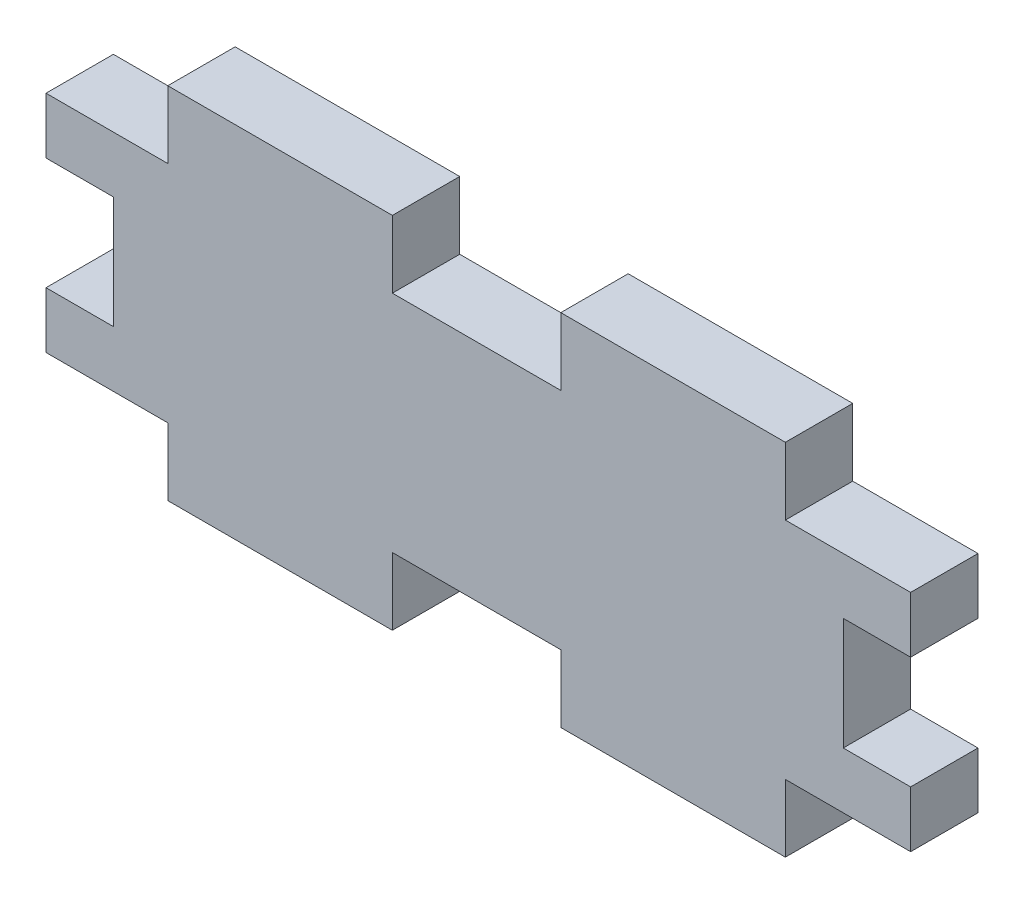
ISO-10303-21;
HEADER;
FILE_DESCRIPTION(('STEP AP214'),'2;1');
FILE_NAME('part.step','',(''),(''),'','','');
FILE_SCHEMA(('AUTOMOTIVE_DESIGN { 1 0 10303 214 1 1 1 1 }'));
ENDSEC;
DATA;
#1=APPLICATION_CONTEXT('core data for automotive mechanical design processes');
#2=APPLICATION_PROTOCOL_DEFINITION('international standard','automotive_design',2000,#1);
#3=PRODUCT_CONTEXT('',#1,'mechanical');
#4=PRODUCT('Part','Part','',(#3));
#5=PRODUCT_RELATED_PRODUCT_CATEGORY('part','',(#4));
#6=PRODUCT_DEFINITION_FORMATION('','',#4);
#7=PRODUCT_DEFINITION_CONTEXT('part definition',#1,'design');
#8=PRODUCT_DEFINITION('design','',#6,#7);
#9=PRODUCT_DEFINITION_SHAPE('','',#8);
#10=(LENGTH_UNIT() NAMED_UNIT(*) SI_UNIT(.MILLI.,.METRE.));
#11=(NAMED_UNIT(*) PLANE_ANGLE_UNIT() SI_UNIT($,.RADIAN.));
#12=(NAMED_UNIT(*) SI_UNIT($,.STERADIAN.) SOLID_ANGLE_UNIT());
#13=UNCERTAINTY_MEASURE_WITH_UNIT(LENGTH_MEASURE(1.E-05),#10,'distance_accuracy_value','');
#14=(GEOMETRIC_REPRESENTATION_CONTEXT(3) GLOBAL_UNCERTAINTY_ASSIGNED_CONTEXT((#13)) GLOBAL_UNIT_ASSIGNED_CONTEXT((#10,
#11,#12)) REPRESENTATION_CONTEXT('',''));
#15=CARTESIAN_POINT('',(0.,0.,0.));
#16=DIRECTION('',(0.,0.,1.));
#17=DIRECTION('',(1.,0.,0.));
#18=AXIS2_PLACEMENT_3D('',#15,#16,#17);
#19=CARTESIAN_POINT('',(19.25,0.,3.));
#20=DIRECTION('',(1.,0.,0.));
#21=DIRECTION('',(0.,0.,-1.));
#22=AXIS2_PLACEMENT_3D('',#19,#20,#21);
#23=PLANE('',#22);
#24=DIRECTION('',(0.,-1.,0.));
#25=VECTOR('',#24,1.);
#26=CARTESIAN_POINT('',(19.25,0.,3.));
#27=LINE('',#26,#25);
#28=CARTESIAN_POINT('',(19.25,35.8396981517135,3.));
#29=VERTEX_POINT('',#28);
#30=CARTESIAN_POINT('',(19.25,33.3396981517135,3.));
#31=VERTEX_POINT('',#30);
#32=EDGE_CURVE('E321',#29,#31,#27,.T.);
#33=ORIENTED_EDGE('',*,*,#32,.T.);
#34=DIRECTION('',(0.,0.,1.));
#35=VECTOR('',#34,1.);
#36=CARTESIAN_POINT('',(19.25,33.3396981517135,0.));
#37=LINE('',#36,#35);
#38=CARTESIAN_POINT('',(19.25,33.3396981517135,0.));
#39=VERTEX_POINT('',#38);
#40=EDGE_CURVE('E315',#39,#31,#37,.T.);
#41=ORIENTED_EDGE('',*,*,#40,.F.);
#42=DIRECTION('',(0.,-1.,0.));
#43=VECTOR('',#42,1.);
#44=CARTESIAN_POINT('',(19.25,0.,0.));
#45=LINE('',#44,#43);
#46=CARTESIAN_POINT('',(19.25,35.8396981517135,0.));
#47=VERTEX_POINT('',#46);
#48=EDGE_CURVE('E371',#47,#39,#45,.T.);
#49=ORIENTED_EDGE('',*,*,#48,.F.);
#50=DIRECTION('',(0.,0.,-1.));
#51=VECTOR('',#50,1.);
#52=CARTESIAN_POINT('',(19.25,35.8396981517135,3.));
#53=LINE('',#52,#51);
#54=EDGE_CURVE('E12',#29,#47,#53,.T.);
#55=ORIENTED_EDGE('',*,*,#54,.F.);
#56=EDGE_LOOP('',(#33,#41,#49,#55));
#57=FACE_BOUND('',#56,.T.);
#58=ADVANCED_FACE('F44',(#57),#23,.T.);
#59=CARTESIAN_POINT('',(-19.25,0.,3.));
#60=DIRECTION('',(1.,0.,0.));
#61=DIRECTION('',(0.,0.,-1.));
#62=AXIS2_PLACEMENT_3D('',#59,#60,#61);
#63=PLANE('',#62);
#64=DIRECTION('',(0.,0.,1.));
#65=VECTOR('',#64,1.);
#66=CARTESIAN_POINT('',(-19.25,28.3396981517135,0.));
#67=LINE('',#66,#65);
#68=CARTESIAN_POINT('',(-19.25,28.3396981517135,0.));
#69=VERTEX_POINT('',#68);
#70=CARTESIAN_POINT('',(-19.25,28.3396981517135,3.));
#71=VERTEX_POINT('',#70);
#72=EDGE_CURVE('E277',#69,#71,#67,.T.);
#73=ORIENTED_EDGE('',*,*,#72,.F.);
#74=DIRECTION('',(0.,-1.,0.));
#75=VECTOR('',#74,1.);
#76=CARTESIAN_POINT('',(-19.25,0.,0.));
#77=LINE('',#76,#75);
#78=CARTESIAN_POINT('',(-19.25,25.8396981517135,0.));
#79=VERTEX_POINT('',#78);
#80=EDGE_CURVE('E409',#69,#79,#77,.T.);
#81=ORIENTED_EDGE('',*,*,#80,.T.);
#82=DIRECTION('',(0.,0.,-1.));
#83=VECTOR('',#82,1.);
#84=CARTESIAN_POINT('',(-19.25,25.8396981517135,3.));
#85=LINE('',#84,#83);
#86=CARTESIAN_POINT('',(-19.25,25.8396981517135,3.));
#87=VERTEX_POINT('',#86);
#88=EDGE_CURVE('E467',#87,#79,#85,.T.);
#89=ORIENTED_EDGE('',*,*,#88,.F.);
#90=DIRECTION('',(0.,-1.,0.));
#91=VECTOR('',#90,1.);
#92=CARTESIAN_POINT('',(-19.25,0.,3.));
#93=LINE('',#92,#91);
#94=EDGE_CURVE('E557',#71,#87,#93,.T.);
#95=ORIENTED_EDGE('',*,*,#94,.F.);
#96=EDGE_LOOP('',(#73,#81,#89,#95));
#97=FACE_BOUND('',#96,.T.);
#98=ADVANCED_FACE('F588',(#97),#63,.F.);
#99=CARTESIAN_POINT('',(0.,0.,3.));
#100=DIRECTION('',(0.,0.,1.));
#101=DIRECTION('',(1.,0.,0.));
#102=AXIS2_PLACEMENT_3D('',#99,#100,#101);
#103=PLANE('',#102);
#104=DIRECTION('',(0.,-1.,0.));
#105=VECTOR('',#104,1.);
#106=CARTESIAN_POINT('',(-16.25,0.,3.));
#107=LINE('',#106,#105);
#108=CARTESIAN_POINT('',(-16.25,33.3396981517135,3.));
#109=VERTEX_POINT('',#108);
#110=CARTESIAN_POINT('',(-16.25,28.3396981517135,3.));
#111=VERTEX_POINT('',#110);
#112=EDGE_CURVE('E237',#109,#111,#107,.T.);
#113=ORIENTED_EDGE('',*,*,#112,.T.);
#114=DIRECTION('',(-1.,0.,0.));
#115=VECTOR('',#114,1.);
#116=CARTESIAN_POINT('',(1.3109743916233E-13,28.3396981517134,3.));
#117=LINE('',#116,#115);
#118=EDGE_CURVE('E253',#111,#71,#117,.T.);
#119=ORIENTED_EDGE('',*,*,#118,.T.);
#120=ORIENTED_EDGE('',*,*,#94,.T.);
#121=DIRECTION('',(1.,0.,0.));
#122=VECTOR('',#121,1.);
#123=CARTESIAN_POINT('',(0.,25.8396981517135,3.));
#124=LINE('',#123,#122);
#125=CARTESIAN_POINT('',(-13.8274217874419,25.8396981517135,3.));
#126=VERTEX_POINT('',#125);
#127=EDGE_CURVE('E336',#87,#126,#124,.T.);
#128=ORIENTED_EDGE('',*,*,#127,.T.);
#129=DIRECTION('',(0.,1.,0.));
#130=VECTOR('',#129,1.);
#131=CARTESIAN_POINT('',(-13.8274217874419,0.,3.));
#132=LINE('',#131,#130);
#133=CARTESIAN_POINT('',(-13.8274217874419,22.8396981517135,3.));
#134=VERTEX_POINT('',#133);
#135=EDGE_CURVE('E340',#134,#126,#132,.T.);
#136=ORIENTED_EDGE('',*,*,#135,.F.);
#137=DIRECTION('',(1.,0.,0.));
#138=VECTOR('',#137,1.);
#139=CARTESIAN_POINT('',(0.,22.8396981517135,3.));
#140=LINE('',#139,#138);
#141=CARTESIAN_POINT('',(-3.82742178744188,22.8396981517135,3.));
#142=VERTEX_POINT('',#141);
#143=EDGE_CURVE('E598',#134,#142,#140,.T.);
#144=ORIENTED_EDGE('',*,*,#143,.T.);
#145=DIRECTION('',(0.,1.,0.));
#146=VECTOR('',#145,1.);
#147=CARTESIAN_POINT('',(-3.82742178744188,0.,3.));
#148=LINE('',#147,#146);
#149=CARTESIAN_POINT('',(-3.82742178744188,25.8396981517135,3.));
#150=VERTEX_POINT('',#149);
#151=EDGE_CURVE('E363',#142,#150,#148,.T.);
#152=ORIENTED_EDGE('',*,*,#151,.T.);
#153=CARTESIAN_POINT('',(3.67257821255812,25.8396981517135,3.));
#154=VERTEX_POINT('',#153);
#155=EDGE_CURVE('E343',#150,#154,#124,.T.);
#156=ORIENTED_EDGE('',*,*,#155,.T.);
#157=DIRECTION('',(0.,1.,0.));
#158=VECTOR('',#157,1.);
#159=CARTESIAN_POINT('',(3.67257821255812,0.,3.));
#160=LINE('',#159,#158);
#161=CARTESIAN_POINT('',(3.67257821255812,22.8396981517135,3.));
#162=VERTEX_POINT('',#161);
#163=EDGE_CURVE('E358',#162,#154,#160,.T.);
#164=ORIENTED_EDGE('',*,*,#163,.F.);
#165=DIRECTION('',(1.,0.,0.));
#166=VECTOR('',#165,1.);
#167=CARTESIAN_POINT('',(0.,22.8396981517135,3.));
#168=LINE('',#167,#166);
#169=CARTESIAN_POINT('',(13.6725782125581,22.8396981517135,3.));
#170=VERTEX_POINT('',#169);
#171=EDGE_CURVE('E362',#162,#170,#168,.T.);
#172=ORIENTED_EDGE('',*,*,#171,.T.);
#173=DIRECTION('',(0.,1.,0.));
#174=VECTOR('',#173,1.);
#175=CARTESIAN_POINT('',(13.6725782125581,0.,3.));
#176=LINE('',#175,#174);
#177=CARTESIAN_POINT('',(13.6725782125581,25.8396981517135,3.));
#178=VERTEX_POINT('',#177);
#179=EDGE_CURVE('E367',#170,#178,#176,.T.);
#180=ORIENTED_EDGE('',*,*,#179,.T.);
#181=CARTESIAN_POINT('',(19.25,25.8396981517135,3.));
#182=VERTEX_POINT('',#181);
#183=EDGE_CURVE('E342',#178,#182,#124,.T.);
#184=ORIENTED_EDGE('',*,*,#183,.T.);
#185=CARTESIAN_POINT('',(19.25,28.3396981517135,3.));
#186=VERTEX_POINT('',#185);
#187=EDGE_CURVE('E327',#186,#182,#27,.T.);
#188=ORIENTED_EDGE('',*,*,#187,.F.);
#189=DIRECTION('',(1.,0.,0.));
#190=VECTOR('',#189,1.);
#191=CARTESIAN_POINT('',(0.,28.3396981517134,3.));
#192=LINE('',#191,#190);
#193=CARTESIAN_POINT('',(16.25,28.3396981517135,3.));
#194=VERTEX_POINT('',#193);
#195=EDGE_CURVE('E298',#194,#186,#192,.T.);
#196=ORIENTED_EDGE('',*,*,#195,.F.);
#197=DIRECTION('',(0.,1.,0.));
#198=VECTOR('',#197,1.);
#199=CARTESIAN_POINT('',(16.25,0.,3.));
#200=LINE('',#199,#198);
#201=CARTESIAN_POINT('',(16.25,33.3396981517135,3.));
#202=VERTEX_POINT('',#201);
#203=EDGE_CURVE('E293',#194,#202,#200,.T.);
#204=ORIENTED_EDGE('',*,*,#203,.T.);
#205=DIRECTION('',(1.,0.,0.));
#206=VECTOR('',#205,1.);
#207=CARTESIAN_POINT('',(0.,33.3396981517134,3.));
#208=LINE('',#207,#206);
#209=EDGE_CURVE('E286',#202,#31,#208,.T.);
#210=ORIENTED_EDGE('',*,*,#209,.T.);
#211=ORIENTED_EDGE('',*,*,#32,.F.);
#212=DIRECTION('',(1.,0.,0.));
#213=VECTOR('',#212,1.);
#214=CARTESIAN_POINT('',(0.,35.8396981517135,3.));
#215=LINE('',#214,#213);
#216=CARTESIAN_POINT('',(13.6725782125581,35.8396981517135,3.));
#217=VERTEX_POINT('',#216);
#218=EDGE_CURVE('E326',#217,#29,#215,.T.);
#219=ORIENTED_EDGE('',*,*,#218,.F.);
#220=DIRECTION('',(0.,-1.,0.));
#221=VECTOR('',#220,1.);
#222=CARTESIAN_POINT('',(13.6725782125581,0.,3.));
#223=LINE('',#222,#221);
#224=CARTESIAN_POINT('',(13.6725782125581,38.8396981517135,3.));
#225=VERTEX_POINT('',#224);
#226=EDGE_CURVE('E501',#225,#217,#223,.T.);
#227=ORIENTED_EDGE('',*,*,#226,.F.);
#228=DIRECTION('',(1.,0.,0.));
#229=VECTOR('',#228,1.);
#230=CARTESIAN_POINT('',(0.,38.8396981517135,3.));
#231=LINE('',#230,#229);
#232=CARTESIAN_POINT('',(3.67257821255812,38.8396981517135,3.));
#233=VERTEX_POINT('',#232);
#234=EDGE_CURVE('E515',#233,#225,#231,.T.);
#235=ORIENTED_EDGE('',*,*,#234,.F.);
#236=DIRECTION('',(0.,-1.,0.));
#237=VECTOR('',#236,1.);
#238=CARTESIAN_POINT('',(3.67257821255812,0.,3.));
#239=LINE('',#238,#237);
#240=CARTESIAN_POINT('',(3.67257821255812,35.8396981517135,3.));
#241=VERTEX_POINT('',#240);
#242=EDGE_CURVE('E522',#233,#241,#239,.T.);
#243=ORIENTED_EDGE('',*,*,#242,.T.);
#244=CARTESIAN_POINT('',(-3.82742178744188,35.8396981517135,3.));
#245=VERTEX_POINT('',#244);
#246=EDGE_CURVE('E525',#245,#241,#215,.T.);
#247=ORIENTED_EDGE('',*,*,#246,.F.);
#248=DIRECTION('',(0.,-1.,0.));
#249=VECTOR('',#248,1.);
#250=CARTESIAN_POINT('',(-3.82742178744187,0.,3.));
#251=LINE('',#250,#249);
#252=CARTESIAN_POINT('',(-3.82742178744188,38.8396981517135,3.));
#253=VERTEX_POINT('',#252);
#254=EDGE_CURVE('E537',#253,#245,#251,.T.);
#255=ORIENTED_EDGE('',*,*,#254,.F.);
#256=DIRECTION('',(1.,0.,0.));
#257=VECTOR('',#256,1.);
#258=CARTESIAN_POINT('',(0.,38.8396981517135,3.));
#259=LINE('',#258,#257);
#260=CARTESIAN_POINT('',(-13.8274217874419,38.8396981517135,3.));
#261=VERTEX_POINT('',#260);
#262=EDGE_CURVE('E542',#261,#253,#259,.T.);
#263=ORIENTED_EDGE('',*,*,#262,.F.);
#264=DIRECTION('',(0.,-1.,0.));
#265=VECTOR('',#264,1.);
#266=CARTESIAN_POINT('',(-13.8274217874419,0.,3.));
#267=LINE('',#266,#265);
#268=CARTESIAN_POINT('',(-13.8274217874419,35.8396981517135,3.));
#269=VERTEX_POINT('',#268);
#270=EDGE_CURVE('E547',#261,#269,#267,.T.);
#271=ORIENTED_EDGE('',*,*,#270,.T.);
#272=CARTESIAN_POINT('',(-19.25,35.8396981517135,3.));
#273=VERTEX_POINT('',#272);
#274=EDGE_CURVE('E524',#273,#269,#215,.T.);
#275=ORIENTED_EDGE('',*,*,#274,.F.);
#276=CARTESIAN_POINT('',(-19.25,33.3396981517135,3.));
#277=VERTEX_POINT('',#276);
#278=EDGE_CURVE('E341',#273,#277,#93,.T.);
#279=ORIENTED_EDGE('',*,*,#278,.T.);
#280=DIRECTION('',(-1.,0.,0.));
#281=VECTOR('',#280,1.);
#282=CARTESIAN_POINT('',(-1.54227085508688E-13,33.3396981517135,3.));
#283=LINE('',#282,#281);
#284=EDGE_CURVE('E257',#109,#277,#283,.T.);
#285=ORIENTED_EDGE('',*,*,#284,.F.);
#286=EDGE_LOOP('',(#113,#119,#120,#128,#136,#144,#152,#156,#164,#172,#180,#184,#188,#196,#204,
#210,#211,#219,#227,#235,#243,#247,#255,#263,#271,#275,#279,#285));
#287=FACE_BOUND('',#286,.T.);
#288=ADVANCED_FACE('F517',(#287),#103,.T.);
#289=CARTESIAN_POINT('',(0.,0.,0.));
#290=DIRECTION('',(0.,0.,1.));
#291=DIRECTION('',(1.,0.,0.));
#292=AXIS2_PLACEMENT_3D('',#289,#290,#291);
#293=PLANE('',#292);
#294=DIRECTION('',(-1.,0.,0.));
#295=VECTOR('',#294,1.);
#296=CARTESIAN_POINT('',(1.3109743916233E-13,28.3396981517134,0.));
#297=LINE('',#296,#295);
#298=CARTESIAN_POINT('',(-16.25,28.3396981517135,0.));
#299=VERTEX_POINT('',#298);
#300=EDGE_CURVE('E240',#299,#69,#297,.T.);
#301=ORIENTED_EDGE('',*,*,#300,.F.);
#302=DIRECTION('',(0.,-1.,0.));
#303=VECTOR('',#302,1.);
#304=CARTESIAN_POINT('',(-16.25,0.,0.));
#305=LINE('',#304,#303);
#306=CARTESIAN_POINT('',(-16.25,33.3396981517135,0.));
#307=VERTEX_POINT('',#306);
#308=EDGE_CURVE('E234',#307,#299,#305,.T.);
#309=ORIENTED_EDGE('',*,*,#308,.F.);
#310=DIRECTION('',(-1.,0.,0.));
#311=VECTOR('',#310,1.);
#312=CARTESIAN_POINT('',(-1.54227085508688E-13,33.3396981517135,0.));
#313=LINE('',#312,#311);
#314=CARTESIAN_POINT('',(-19.25,33.3396981517135,0.));
#315=VERTEX_POINT('',#314);
#316=EDGE_CURVE('E242',#307,#315,#313,.T.);
#317=ORIENTED_EDGE('',*,*,#316,.T.);
#318=CARTESIAN_POINT('',(-19.25,35.8396981517135,0.));
#319=VERTEX_POINT('',#318);
#320=EDGE_CURVE('E405',#319,#315,#77,.T.);
#321=ORIENTED_EDGE('',*,*,#320,.F.);
#322=DIRECTION('',(1.,0.,0.));
#323=VECTOR('',#322,1.);
#324=CARTESIAN_POINT('',(0.,35.8396981517135,0.));
#325=LINE('',#324,#323);
#326=CARTESIAN_POINT('',(-13.8274217874419,35.8396981517135,0.));
#327=VERTEX_POINT('',#326);
#328=EDGE_CURVE('E380',#319,#327,#325,.T.);
#329=ORIENTED_EDGE('',*,*,#328,.T.);
#330=DIRECTION('',(0.,-1.,0.));
#331=VECTOR('',#330,1.);
#332=CARTESIAN_POINT('',(-13.8274217874419,0.,0.));
#333=LINE('',#332,#331);
#334=CARTESIAN_POINT('',(-13.8274217874419,38.8396981517135,0.));
#335=VERTEX_POINT('',#334);
#336=EDGE_CURVE('E401',#335,#327,#333,.T.);
#337=ORIENTED_EDGE('',*,*,#336,.F.);
#338=DIRECTION('',(1.,0.,0.));
#339=VECTOR('',#338,1.);
#340=CARTESIAN_POINT('',(0.,38.8396981517135,0.));
#341=LINE('',#340,#339);
#342=CARTESIAN_POINT('',(-3.82742178744188,38.8396981517135,0.));
#343=VERTEX_POINT('',#342);
#344=EDGE_CURVE('E397',#335,#343,#341,.T.);
#345=ORIENTED_EDGE('',*,*,#344,.T.);
#346=DIRECTION('',(0.,-1.,0.));
#347=VECTOR('',#346,1.);
#348=CARTESIAN_POINT('',(-3.82742178744187,0.,0.));
#349=LINE('',#348,#347);
#350=CARTESIAN_POINT('',(-3.82742178744188,35.8396981517135,0.));
#351=VERTEX_POINT('',#350);
#352=EDGE_CURVE('E393',#343,#351,#349,.T.);
#353=ORIENTED_EDGE('',*,*,#352,.T.);
#354=CARTESIAN_POINT('',(3.67257821255812,35.8396981517135,0.));
#355=VERTEX_POINT('',#354);
#356=EDGE_CURVE('E381',#351,#355,#325,.T.);
#357=ORIENTED_EDGE('',*,*,#356,.T.);
#358=DIRECTION('',(0.,-1.,0.));
#359=VECTOR('',#358,1.);
#360=CARTESIAN_POINT('',(3.67257821255812,0.,0.));
#361=LINE('',#360,#359);
#362=CARTESIAN_POINT('',(3.67257821255812,38.8396981517135,0.));
#363=VERTEX_POINT('',#362);
#364=EDGE_CURVE('E389',#363,#355,#361,.T.);
#365=ORIENTED_EDGE('',*,*,#364,.F.);
#366=DIRECTION('',(1.,0.,0.));
#367=VECTOR('',#366,1.);
#368=CARTESIAN_POINT('',(0.,38.8396981517135,0.));
#369=LINE('',#368,#367);
#370=CARTESIAN_POINT('',(13.6725782125581,38.8396981517135,0.));
#371=VERTEX_POINT('',#370);
#372=EDGE_CURVE('E385',#363,#371,#369,.T.);
#373=ORIENTED_EDGE('',*,*,#372,.T.);
#374=DIRECTION('',(0.,-1.,0.));
#375=VECTOR('',#374,1.);
#376=CARTESIAN_POINT('',(13.6725782125581,0.,0.));
#377=LINE('',#376,#375);
#378=CARTESIAN_POINT('',(13.6725782125581,35.8396981517135,0.));
#379=VERTEX_POINT('',#378);
#380=EDGE_CURVE('E379',#371,#379,#377,.T.);
#381=ORIENTED_EDGE('',*,*,#380,.T.);
#382=EDGE_CURVE('E375',#379,#47,#325,.T.);
#383=ORIENTED_EDGE('',*,*,#382,.T.);
#384=ORIENTED_EDGE('',*,*,#48,.T.);
#385=DIRECTION('',(1.,0.,0.));
#386=VECTOR('',#385,1.);
#387=CARTESIAN_POINT('',(0.,33.3396981517134,0.));
#388=LINE('',#387,#386);
#389=CARTESIAN_POINT('',(16.25,33.3396981517135,0.));
#390=VERTEX_POINT('',#389);
#391=EDGE_CURVE('E289',#390,#39,#388,.T.);
#392=ORIENTED_EDGE('',*,*,#391,.F.);
#393=DIRECTION('',(0.,1.,0.));
#394=VECTOR('',#393,1.);
#395=CARTESIAN_POINT('',(16.25,0.,0.));
#396=LINE('',#395,#394);
#397=CARTESIAN_POINT('',(16.25,28.3396981517135,0.));
#398=VERTEX_POINT('',#397);
#399=EDGE_CURVE('E282',#398,#390,#396,.T.);
#400=ORIENTED_EDGE('',*,*,#399,.F.);
#401=DIRECTION('',(1.,0.,0.));
#402=VECTOR('',#401,1.);
#403=CARTESIAN_POINT('',(0.,28.3396981517134,0.));
#404=LINE('',#403,#402);
#405=CARTESIAN_POINT('',(19.25,28.3396981517135,0.));
#406=VERTEX_POINT('',#405);
#407=EDGE_CURVE('E285',#398,#406,#404,.T.);
#408=ORIENTED_EDGE('',*,*,#407,.T.);
#409=CARTESIAN_POINT('',(19.25,25.8396981517135,0.));
#410=VERTEX_POINT('',#409);
#411=EDGE_CURVE('E276',#406,#410,#45,.T.);
#412=ORIENTED_EDGE('',*,*,#411,.T.);
#413=DIRECTION('',(1.,0.,0.));
#414=VECTOR('',#413,1.);
#415=CARTESIAN_POINT('',(0.,25.8396981517135,0.));
#416=LINE('',#415,#414);
#417=CARTESIAN_POINT('',(13.6725782125581,25.8396981517135,0.));
#418=VERTEX_POINT('',#417);
#419=EDGE_CURVE('E414',#418,#410,#416,.T.);
#420=ORIENTED_EDGE('',*,*,#419,.F.);
#421=DIRECTION('',(0.,1.,0.));
#422=VECTOR('',#421,1.);
#423=CARTESIAN_POINT('',(13.6725782125581,0.,0.));
#424=LINE('',#423,#422);
#425=CARTESIAN_POINT('',(13.6725782125581,22.8396981517135,0.));
#426=VERTEX_POINT('',#425);
#427=EDGE_CURVE('E432',#426,#418,#424,.T.);
#428=ORIENTED_EDGE('',*,*,#427,.F.);
#429=DIRECTION('',(1.,0.,0.));
#430=VECTOR('',#429,1.);
#431=CARTESIAN_POINT('',(0.,22.8396981517135,0.));
#432=LINE('',#431,#430);
#433=CARTESIAN_POINT('',(3.67257821255812,22.8396981517135,0.));
#434=VERTEX_POINT('',#433);
#435=EDGE_CURVE('E429',#434,#426,#432,.T.);
#436=ORIENTED_EDGE('',*,*,#435,.F.);
#437=DIRECTION('',(0.,1.,0.));
#438=VECTOR('',#437,1.);
#439=CARTESIAN_POINT('',(3.67257821255812,0.,0.));
#440=LINE('',#439,#438);
#441=CARTESIAN_POINT('',(3.67257821255812,25.8396981517135,0.));
#442=VERTEX_POINT('',#441);
#443=EDGE_CURVE('E425',#434,#442,#440,.T.);
#444=ORIENTED_EDGE('',*,*,#443,.T.);
#445=CARTESIAN_POINT('',(-3.82742178744188,25.8396981517135,0.));
#446=VERTEX_POINT('',#445);
#447=EDGE_CURVE('E415',#446,#442,#416,.T.);
#448=ORIENTED_EDGE('',*,*,#447,.F.);
#449=DIRECTION('',(0.,1.,0.));
#450=VECTOR('',#449,1.);
#451=CARTESIAN_POINT('',(-3.82742178744188,0.,0.));
#452=LINE('',#451,#450);
#453=CARTESIAN_POINT('',(-3.82742178744188,22.8396981517135,0.));
#454=VERTEX_POINT('',#453);
#455=EDGE_CURVE('E422',#454,#446,#452,.T.);
#456=ORIENTED_EDGE('',*,*,#455,.F.);
#457=DIRECTION('',(1.,0.,0.));
#458=VECTOR('',#457,1.);
#459=CARTESIAN_POINT('',(0.,22.8396981517135,0.));
#460=LINE('',#459,#458);
#461=CARTESIAN_POINT('',(-13.8274217874419,22.8396981517135,0.));
#462=VERTEX_POINT('',#461);
#463=EDGE_CURVE('E419',#462,#454,#460,.T.);
#464=ORIENTED_EDGE('',*,*,#463,.F.);
#465=DIRECTION('',(0.,1.,0.));
#466=VECTOR('',#465,1.);
#467=CARTESIAN_POINT('',(-13.8274217874419,0.,0.));
#468=LINE('',#467,#466);
#469=CARTESIAN_POINT('',(-13.8274217874419,25.8396981517135,0.));
#470=VERTEX_POINT('',#469);
#471=EDGE_CURVE('E413',#462,#470,#468,.T.);
#472=ORIENTED_EDGE('',*,*,#471,.T.);
#473=EDGE_CURVE('E408',#79,#470,#416,.T.);
#474=ORIENTED_EDGE('',*,*,#473,.F.);
#475=ORIENTED_EDGE('',*,*,#80,.F.);
#476=EDGE_LOOP('',(#301,#309,#317,#321,#329,#337,#345,#353,#357,#365,#373,#381,#383,#384,#392,
#400,#408,#412,#420,#428,#436,#444,#448,#456,#464,#472,#474,#475));
#477=FACE_BOUND('',#476,.T.);
#478=ADVANCED_FACE('F250',(#477),#293,.F.);
#479=DIRECTION('',(0.,0.,1.));
#480=VECTOR('',#479,1.);
#481=CARTESIAN_POINT('',(19.25,28.3396981517135,0.));
#482=LINE('',#481,#480);
#483=EDGE_CURVE('E68',#406,#186,#482,.T.);
#484=ORIENTED_EDGE('',*,*,#483,.T.);
#485=ORIENTED_EDGE('',*,*,#187,.T.);
#486=DIRECTION('',(0.,0.,-1.));
#487=VECTOR('',#486,1.);
#488=CARTESIAN_POINT('',(19.25,25.8396981517135,3.));
#489=LINE('',#488,#487);
#490=EDGE_CURVE('E435',#182,#410,#489,.T.);
#491=ORIENTED_EDGE('',*,*,#490,.T.);
#492=ORIENTED_EDGE('',*,*,#411,.F.);
#493=EDGE_LOOP('',(#484,#485,#491,#492));
#494=FACE_BOUND('',#493,.T.);
#495=ADVANCED_FACE('F46',(#494),#23,.T.);
#496=CARTESIAN_POINT('',(0.,35.8396981517135,3.));
#497=DIRECTION('',(0.,1.,0.));
#498=DIRECTION('',(0.,0.,1.));
#499=AXIS2_PLACEMENT_3D('',#496,#497,#498);
#500=PLANE('',#499);
#501=ORIENTED_EDGE('',*,*,#382,.F.);
#502=DIRECTION('',(0.,0.,-1.));
#503=VECTOR('',#502,1.);
#504=CARTESIAN_POINT('',(13.6725782125581,35.8396981517135,3.));
#505=LINE('',#504,#503);
#506=EDGE_CURVE('E53',#217,#379,#505,.T.);
#507=ORIENTED_EDGE('',*,*,#506,.F.);
#508=ORIENTED_EDGE('',*,*,#218,.T.);
#509=ORIENTED_EDGE('',*,*,#54,.T.);
#510=EDGE_LOOP('',(#501,#507,#508,#509));
#511=FACE_BOUND('',#510,.T.);
#512=ADVANCED_FACE('F505',(#511),#500,.T.);
#513=CARTESIAN_POINT('',(13.6725782125581,0.,3.));
#514=DIRECTION('',(1.,0.,0.));
#515=DIRECTION('',(0.,1.,0.));
#516=AXIS2_PLACEMENT_3D('',#513,#514,#515);
#517=PLANE('',#516);
#518=ORIENTED_EDGE('',*,*,#380,.F.);
#519=DIRECTION('',(0.,0.,-1.));
#520=VECTOR('',#519,1.);
#521=CARTESIAN_POINT('',(13.6725782125581,38.8396981517135,3.));
#522=LINE('',#521,#520);
#523=EDGE_CURVE('E492',#225,#371,#522,.T.);
#524=ORIENTED_EDGE('',*,*,#523,.F.);
#525=ORIENTED_EDGE('',*,*,#226,.T.);
#526=ORIENTED_EDGE('',*,*,#506,.T.);
#527=EDGE_LOOP('',(#518,#524,#525,#526));
#528=FACE_BOUND('',#527,.T.);
#529=ADVANCED_FACE('F499',(#528),#517,.T.);
#530=CARTESIAN_POINT('',(0.,38.8396981517135,3.));
#531=DIRECTION('',(0.,1.,0.));
#532=DIRECTION('',(0.,0.,1.));
#533=AXIS2_PLACEMENT_3D('',#530,#531,#532);
#534=PLANE('',#533);
#535=ORIENTED_EDGE('',*,*,#372,.F.);
#536=DIRECTION('',(0.,0.,-1.));
#537=VECTOR('',#536,1.);
#538=CARTESIAN_POINT('',(3.67257821255812,38.8396981517135,3.));
#539=LINE('',#538,#537);
#540=EDGE_CURVE('E489',#233,#363,#539,.T.);
#541=ORIENTED_EDGE('',*,*,#540,.F.);
#542=ORIENTED_EDGE('',*,*,#234,.T.);
#543=ORIENTED_EDGE('',*,*,#523,.T.);
#544=EDGE_LOOP('',(#535,#541,#542,#543));
#545=FACE_BOUND('',#544,.T.);
#546=ADVANCED_FACE('F511',(#545),#534,.T.);
#547=CARTESIAN_POINT('',(3.67257821255812,0.,3.));
#548=DIRECTION('',(1.,0.,0.));
#549=DIRECTION('',(0.,0.,-1.));
#550=AXIS2_PLACEMENT_3D('',#547,#548,#549);
#551=PLANE('',#550);
#552=ORIENTED_EDGE('',*,*,#364,.T.);
#553=DIRECTION('',(0.,0.,-1.));
#554=VECTOR('',#553,1.);
#555=CARTESIAN_POINT('',(3.67257821255812,35.8396981517135,3.));
#556=LINE('',#555,#554);
#557=EDGE_CURVE('E486',#241,#355,#556,.T.);
#558=ORIENTED_EDGE('',*,*,#557,.F.);
#559=ORIENTED_EDGE('',*,*,#242,.F.);
#560=ORIENTED_EDGE('',*,*,#540,.T.);
#561=EDGE_LOOP('',(#552,#558,#559,#560));
#562=FACE_BOUND('',#561,.T.);
#563=ADVANCED_FACE('F651',(#562),#551,.F.);
#564=ORIENTED_EDGE('',*,*,#356,.F.);
#565=DIRECTION('',(0.,0.,-1.));
#566=VECTOR('',#565,1.);
#567=CARTESIAN_POINT('',(-3.82742178744188,35.8396981517135,3.));
#568=LINE('',#567,#566);
#569=EDGE_CURVE('E483',#245,#351,#568,.T.);
#570=ORIENTED_EDGE('',*,*,#569,.F.);
#571=ORIENTED_EDGE('',*,*,#246,.T.);
#572=ORIENTED_EDGE('',*,*,#557,.T.);
#573=EDGE_LOOP('',(#564,#570,#571,#572));
#574=FACE_BOUND('',#573,.T.);
#575=ADVANCED_FACE('F648',(#574),#500,.T.);
#576=CARTESIAN_POINT('',(-3.82742178744187,0.,3.));
#577=DIRECTION('',(1.,0.,0.));
#578=DIRECTION('',(0.,1.,0.));
#579=AXIS2_PLACEMENT_3D('',#576,#577,#578);
#580=PLANE('',#579);
#581=ORIENTED_EDGE('',*,*,#352,.F.);
#582=DIRECTION('',(0.,0.,-1.));
#583=VECTOR('',#582,1.);
#584=CARTESIAN_POINT('',(-3.82742178744188,38.8396981517135,3.));
#585=LINE('',#584,#583);
#586=EDGE_CURVE('E480',#253,#343,#585,.T.);
#587=ORIENTED_EDGE('',*,*,#586,.F.);
#588=ORIENTED_EDGE('',*,*,#254,.T.);
#589=ORIENTED_EDGE('',*,*,#569,.T.);
#590=EDGE_LOOP('',(#581,#587,#588,#589));
#591=FACE_BOUND('',#590,.T.);
#592=ADVANCED_FACE('F567',(#591),#580,.T.);
#593=CARTESIAN_POINT('',(0.,38.8396981517135,3.));
#594=DIRECTION('',(0.,1.,0.));
#595=DIRECTION('',(0.,0.,1.));
#596=AXIS2_PLACEMENT_3D('',#593,#594,#595);
#597=PLANE('',#596);
#598=ORIENTED_EDGE('',*,*,#344,.F.);
#599=DIRECTION('',(0.,0.,-1.));
#600=VECTOR('',#599,1.);
#601=CARTESIAN_POINT('',(-13.8274217874419,38.8396981517135,3.));
#602=LINE('',#601,#600);
#603=EDGE_CURVE('E477',#261,#335,#602,.T.);
#604=ORIENTED_EDGE('',*,*,#603,.F.);
#605=ORIENTED_EDGE('',*,*,#262,.T.);
#606=ORIENTED_EDGE('',*,*,#586,.T.);
#607=EDGE_LOOP('',(#598,#604,#605,#606));
#608=FACE_BOUND('',#607,.T.);
#609=ADVANCED_FACE('F561',(#608),#597,.T.);
#610=CARTESIAN_POINT('',(-13.8274217874419,0.,3.));
#611=DIRECTION('',(1.,0.,0.));
#612=DIRECTION('',(0.,0.,-1.));
#613=AXIS2_PLACEMENT_3D('',#610,#611,#612);
#614=PLANE('',#613);
#615=ORIENTED_EDGE('',*,*,#336,.T.);
#616=DIRECTION('',(0.,0.,-1.));
#617=VECTOR('',#616,1.);
#618=CARTESIAN_POINT('',(-13.8274217874419,35.8396981517135,3.));
#619=LINE('',#618,#617);
#620=EDGE_CURVE('E474',#269,#327,#619,.T.);
#621=ORIENTED_EDGE('',*,*,#620,.F.);
#622=ORIENTED_EDGE('',*,*,#270,.F.);
#623=ORIENTED_EDGE('',*,*,#603,.T.);
#624=EDGE_LOOP('',(#615,#621,#622,#623));
#625=FACE_BOUND('',#624,.T.);
#626=ADVANCED_FACE('F573',(#625),#614,.F.);
#627=ORIENTED_EDGE('',*,*,#328,.F.);
#628=DIRECTION('',(0.,0.,-1.));
#629=VECTOR('',#628,1.);
#630=CARTESIAN_POINT('',(-19.25,35.8396981517135,3.));
#631=LINE('',#630,#629);
#632=EDGE_CURVE('E471',#273,#319,#631,.T.);
#633=ORIENTED_EDGE('',*,*,#632,.F.);
#634=ORIENTED_EDGE('',*,*,#274,.T.);
#635=ORIENTED_EDGE('',*,*,#620,.T.);
#636=EDGE_LOOP('',(#627,#633,#634,#635));
#637=FACE_BOUND('',#636,.T.);
#638=ADVANCED_FACE('F575',(#637),#500,.T.);
#639=ORIENTED_EDGE('',*,*,#320,.T.);
#640=DIRECTION('',(0.,0.,1.));
#641=VECTOR('',#640,1.);
#642=CARTESIAN_POINT('',(-19.25,33.3396981517135,0.));
#643=LINE('',#642,#641);
#644=EDGE_CURVE('E60',#315,#277,#643,.T.);
#645=ORIENTED_EDGE('',*,*,#644,.T.);
#646=ORIENTED_EDGE('',*,*,#278,.F.);
#647=ORIENTED_EDGE('',*,*,#632,.T.);
#648=EDGE_LOOP('',(#639,#645,#646,#647));
#649=FACE_BOUND('',#648,.T.);
#650=ADVANCED_FACE('F667',(#649),#63,.F.);
#651=CARTESIAN_POINT('',(0.,25.8396981517135,3.));
#652=DIRECTION('',(0.,1.,0.));
#653=DIRECTION('',(0.,0.,1.));
#654=AXIS2_PLACEMENT_3D('',#651,#652,#653);
#655=PLANE('',#654);
#656=ORIENTED_EDGE('',*,*,#473,.T.);
#657=DIRECTION('',(0.,0.,-1.));
#658=VECTOR('',#657,1.);
#659=CARTESIAN_POINT('',(-13.8274217874419,25.8396981517135,3.));
#660=LINE('',#659,#658);
#661=EDGE_CURVE('E464',#126,#470,#660,.T.);
#662=ORIENTED_EDGE('',*,*,#661,.F.);
#663=ORIENTED_EDGE('',*,*,#127,.F.);
#664=ORIENTED_EDGE('',*,*,#88,.T.);
#665=EDGE_LOOP('',(#656,#662,#663,#664));
#666=FACE_BOUND('',#665,.T.);
#667=ADVANCED_FACE('F591',(#666),#655,.F.);
#668=CARTESIAN_POINT('',(-13.8274217874419,0.,3.));
#669=DIRECTION('',(-1.,0.,0.));
#670=DIRECTION('',(0.,0.,1.));
#671=AXIS2_PLACEMENT_3D('',#668,#669,#670);
#672=PLANE('',#671);
#673=ORIENTED_EDGE('',*,*,#471,.F.);
#674=DIRECTION('',(0.,0.,-1.));
#675=VECTOR('',#674,1.);
#676=CARTESIAN_POINT('',(-13.8274217874419,22.8396981517135,3.));
#677=LINE('',#676,#675);
#678=EDGE_CURVE('E461',#134,#462,#677,.T.);
#679=ORIENTED_EDGE('',*,*,#678,.F.);
#680=ORIENTED_EDGE('',*,*,#135,.T.);
#681=ORIENTED_EDGE('',*,*,#661,.T.);
#682=EDGE_LOOP('',(#673,#679,#680,#681));
#683=FACE_BOUND('',#682,.T.);
#684=ADVANCED_FACE('F595',(#683),#672,.T.);
#685=CARTESIAN_POINT('',(0.,22.8396981517135,3.));
#686=DIRECTION('',(0.,1.,0.));
#687=DIRECTION('',(0.,0.,1.));
#688=AXIS2_PLACEMENT_3D('',#685,#686,#687);
#689=PLANE('',#688);
#690=ORIENTED_EDGE('',*,*,#463,.T.);
#691=DIRECTION('',(0.,0.,-1.));
#692=VECTOR('',#691,1.);
#693=CARTESIAN_POINT('',(-3.82742178744188,22.8396981517135,3.));
#694=LINE('',#693,#692);
#695=EDGE_CURVE('E457',#142,#454,#694,.T.);
#696=ORIENTED_EDGE('',*,*,#695,.F.);
#697=ORIENTED_EDGE('',*,*,#143,.F.);
#698=ORIENTED_EDGE('',*,*,#678,.T.);
#699=EDGE_LOOP('',(#690,#696,#697,#698));
#700=FACE_BOUND('',#699,.T.);
#701=ADVANCED_FACE('F692',(#700),#689,.F.);
#702=CARTESIAN_POINT('',(-3.82742178744188,0.,3.));
#703=DIRECTION('',(-1.,0.,0.));
#704=DIRECTION('',(0.,-1.,0.));
#705=AXIS2_PLACEMENT_3D('',#702,#703,#704);
#706=PLANE('',#705);
#707=ORIENTED_EDGE('',*,*,#455,.T.);
#708=DIRECTION('',(0.,0.,-1.));
#709=VECTOR('',#708,1.);
#710=CARTESIAN_POINT('',(-3.82742178744188,25.8396981517135,3.));
#711=LINE('',#710,#709);
#712=EDGE_CURVE('E453',#150,#446,#711,.T.);
#713=ORIENTED_EDGE('',*,*,#712,.F.);
#714=ORIENTED_EDGE('',*,*,#151,.F.);
#715=ORIENTED_EDGE('',*,*,#695,.T.);
#716=EDGE_LOOP('',(#707,#713,#714,#715));
#717=FACE_BOUND('',#716,.T.);
#718=ADVANCED_FACE('F689',(#717),#706,.F.);
#719=ORIENTED_EDGE('',*,*,#447,.T.);
#720=DIRECTION('',(0.,0.,-1.));
#721=VECTOR('',#720,1.);
#722=CARTESIAN_POINT('',(3.67257821255812,25.8396981517135,3.));
#723=LINE('',#722,#721);
#724=EDGE_CURVE('E450',#154,#442,#723,.T.);
#725=ORIENTED_EDGE('',*,*,#724,.F.);
#726=ORIENTED_EDGE('',*,*,#155,.F.);
#727=ORIENTED_EDGE('',*,*,#712,.T.);
#728=EDGE_LOOP('',(#719,#725,#726,#727));
#729=FACE_BOUND('',#728,.T.);
#730=ADVANCED_FACE('F629',(#729),#655,.F.);
#731=CARTESIAN_POINT('',(3.67257821255812,0.,3.));
#732=DIRECTION('',(-1.,0.,0.));
#733=DIRECTION('',(0.,0.,1.));
#734=AXIS2_PLACEMENT_3D('',#731,#732,#733);
#735=PLANE('',#734);
#736=ORIENTED_EDGE('',*,*,#443,.F.);
#737=DIRECTION('',(0.,0.,-1.));
#738=VECTOR('',#737,1.);
#739=CARTESIAN_POINT('',(3.67257821255812,22.8396981517135,3.));
#740=LINE('',#739,#738);
#741=EDGE_CURVE('E447',#162,#434,#740,.T.);
#742=ORIENTED_EDGE('',*,*,#741,.F.);
#743=ORIENTED_EDGE('',*,*,#163,.T.);
#744=ORIENTED_EDGE('',*,*,#724,.T.);
#745=EDGE_LOOP('',(#736,#742,#743,#744));
#746=FACE_BOUND('',#745,.T.);
#747=ADVANCED_FACE('F635',(#746),#735,.T.);
#748=CARTESIAN_POINT('',(0.,22.8396981517135,3.));
#749=DIRECTION('',(0.,1.,0.));
#750=DIRECTION('',(0.,0.,1.));
#751=AXIS2_PLACEMENT_3D('',#748,#749,#750);
#752=PLANE('',#751);
#753=ORIENTED_EDGE('',*,*,#435,.T.);
#754=DIRECTION('',(0.,0.,-1.));
#755=VECTOR('',#754,1.);
#756=CARTESIAN_POINT('',(13.6725782125581,22.8396981517135,3.));
#757=LINE('',#756,#755);
#758=EDGE_CURVE('E443',#170,#426,#757,.T.);
#759=ORIENTED_EDGE('',*,*,#758,.F.);
#760=ORIENTED_EDGE('',*,*,#171,.F.);
#761=ORIENTED_EDGE('',*,*,#741,.T.);
#762=EDGE_LOOP('',(#753,#759,#760,#761));
#763=FACE_BOUND('',#762,.T.);
#764=ADVANCED_FACE('F639',(#763),#752,.F.);
#765=CARTESIAN_POINT('',(13.6725782125581,0.,3.));
#766=DIRECTION('',(-1.,0.,0.));
#767=DIRECTION('',(0.,-1.,0.));
#768=AXIS2_PLACEMENT_3D('',#765,#766,#767);
#769=PLANE('',#768);
#770=ORIENTED_EDGE('',*,*,#427,.T.);
#771=DIRECTION('',(0.,0.,-1.));
#772=VECTOR('',#771,1.);
#773=CARTESIAN_POINT('',(13.6725782125581,25.8396981517135,3.));
#774=LINE('',#773,#772);
#775=EDGE_CURVE('E439',#178,#418,#774,.T.);
#776=ORIENTED_EDGE('',*,*,#775,.F.);
#777=ORIENTED_EDGE('',*,*,#179,.F.);
#778=ORIENTED_EDGE('',*,*,#758,.T.);
#779=EDGE_LOOP('',(#770,#776,#777,#778));
#780=FACE_BOUND('',#779,.T.);
#781=ADVANCED_FACE('F641',(#780),#769,.F.);
#782=ORIENTED_EDGE('',*,*,#419,.T.);
#783=ORIENTED_EDGE('',*,*,#490,.F.);
#784=ORIENTED_EDGE('',*,*,#183,.F.);
#785=ORIENTED_EDGE('',*,*,#775,.T.);
#786=EDGE_LOOP('',(#782,#783,#784,#785));
#787=FACE_BOUND('',#786,.T.);
#788=ADVANCED_FACE('F619',(#787),#655,.F.);
#789=CARTESIAN_POINT('',(16.25,0.,0.));
#790=DIRECTION('',(1.,0.,0.));
#791=DIRECTION('',(0.,0.,-1.));
#792=AXIS2_PLACEMENT_3D('',#789,#790,#791);
#793=PLANE('',#792);
#794=ORIENTED_EDGE('',*,*,#203,.F.);
#795=DIRECTION('',(0.,0.,1.));
#796=VECTOR('',#795,1.);
#797=CARTESIAN_POINT('',(16.25,28.3396981517135,0.));
#798=LINE('',#797,#796);
#799=EDGE_CURVE('E292',#398,#194,#798,.T.);
#800=ORIENTED_EDGE('',*,*,#799,.F.);
#801=ORIENTED_EDGE('',*,*,#399,.T.);
#802=DIRECTION('',(0.,0.,1.));
#803=VECTOR('',#802,1.);
#804=CARTESIAN_POINT('',(16.25,33.3396981517135,0.));
#805=LINE('',#804,#803);
#806=EDGE_CURVE('E264',#390,#202,#805,.T.);
#807=ORIENTED_EDGE('',*,*,#806,.T.);
#808=EDGE_LOOP('',(#794,#800,#801,#807));
#809=FACE_BOUND('',#808,.T.);
#810=ADVANCED_FACE('F682',(#809),#793,.T.);
#811=CARTESIAN_POINT('',(0.,33.3396981517134,0.));
#812=DIRECTION('',(0.,-1.,0.));
#813=DIRECTION('',(1.,0.,0.));
#814=AXIS2_PLACEMENT_3D('',#811,#812,#813);
#815=PLANE('',#814);
#816=ORIENTED_EDGE('',*,*,#209,.F.);
#817=ORIENTED_EDGE('',*,*,#806,.F.);
#818=ORIENTED_EDGE('',*,*,#391,.T.);
#819=ORIENTED_EDGE('',*,*,#40,.T.);
#820=EDGE_LOOP('',(#816,#817,#818,#819));
#821=FACE_BOUND('',#820,.T.);
#822=ADVANCED_FACE('F769',(#821),#815,.T.);
#823=CARTESIAN_POINT('',(0.,28.3396981517134,0.));
#824=DIRECTION('',(0.,-1.,0.));
#825=DIRECTION('',(1.,0.,0.));
#826=AXIS2_PLACEMENT_3D('',#823,#824,#825);
#827=PLANE('',#826);
#828=ORIENTED_EDGE('',*,*,#195,.T.);
#829=ORIENTED_EDGE('',*,*,#483,.F.);
#830=ORIENTED_EDGE('',*,*,#407,.F.);
#831=ORIENTED_EDGE('',*,*,#799,.T.);
#832=EDGE_LOOP('',(#828,#829,#830,#831));
#833=FACE_BOUND('',#832,.T.);
#834=ADVANCED_FACE('F776',(#833),#827,.F.);
#835=CARTESIAN_POINT('',(-16.25,0.,0.));
#836=DIRECTION('',(-1.,0.,0.));
#837=DIRECTION('',(0.,0.,1.));
#838=AXIS2_PLACEMENT_3D('',#835,#836,#837);
#839=PLANE('',#838);
#840=ORIENTED_EDGE('',*,*,#112,.F.);
#841=DIRECTION('',(0.,0.,1.));
#842=VECTOR('',#841,1.);
#843=CARTESIAN_POINT('',(-16.25,33.3396981517135,0.));
#844=LINE('',#843,#842);
#845=EDGE_CURVE('E230',#307,#109,#844,.T.);
#846=ORIENTED_EDGE('',*,*,#845,.F.);
#847=ORIENTED_EDGE('',*,*,#308,.T.);
#848=DIRECTION('',(0.,0.,1.));
#849=VECTOR('',#848,1.);
#850=CARTESIAN_POINT('',(-16.25,28.3396981517135,0.));
#851=LINE('',#850,#849);
#852=EDGE_CURVE('E273',#299,#111,#851,.T.);
#853=ORIENTED_EDGE('',*,*,#852,.T.);
#854=EDGE_LOOP('',(#840,#846,#847,#853));
#855=FACE_BOUND('',#854,.T.);
#856=ADVANCED_FACE('F231',(#855),#839,.T.);
#857=CARTESIAN_POINT('',(1.3109743916233E-13,28.3396981517134,0.));
#858=DIRECTION('',(0.,1.,0.));
#859=DIRECTION('',(-1.,0.,0.));
#860=AXIS2_PLACEMENT_3D('',#857,#858,#859);
#861=PLANE('',#860);
#862=ORIENTED_EDGE('',*,*,#118,.F.);
#863=ORIENTED_EDGE('',*,*,#852,.F.);
#864=ORIENTED_EDGE('',*,*,#300,.T.);
#865=ORIENTED_EDGE('',*,*,#72,.T.);
#866=EDGE_LOOP('',(#862,#863,#864,#865));
#867=FACE_BOUND('',#866,.T.);
#868=ADVANCED_FACE('F790',(#867),#861,.T.);
#869=CARTESIAN_POINT('',(-1.54227085508688E-13,33.3396981517135,0.));
#870=DIRECTION('',(0.,1.,0.));
#871=DIRECTION('',(-1.,0.,0.));
#872=AXIS2_PLACEMENT_3D('',#869,#870,#871);
#873=PLANE('',#872);
#874=ORIENTED_EDGE('',*,*,#284,.T.);
#875=ORIENTED_EDGE('',*,*,#644,.F.);
#876=ORIENTED_EDGE('',*,*,#316,.F.);
#877=ORIENTED_EDGE('',*,*,#845,.T.);
#878=EDGE_LOOP('',(#874,#875,#876,#877));
#879=FACE_BOUND('',#878,.T.);
#880=ADVANCED_FACE('F243',(#879),#873,.F.);
#881=CLOSED_SHELL('',(#58,#98,#288,#478,#495,#512,#529,#546,#563,#575,#592,#609,#626,#638,#650,
#667,#684,#701,#718,#730,#747,#764,#781,#788,#810,#822,#834,#856,#868,#880));
#882=MANIFOLD_SOLID_BREP('B2',#881);
#883=ADVANCED_BREP_SHAPE_REPRESENTATION('',(#18,#882),#14);
#884=SHAPE_DEFINITION_REPRESENTATION(#9,#883);
ENDSEC;
END-ISO-10303-21;
